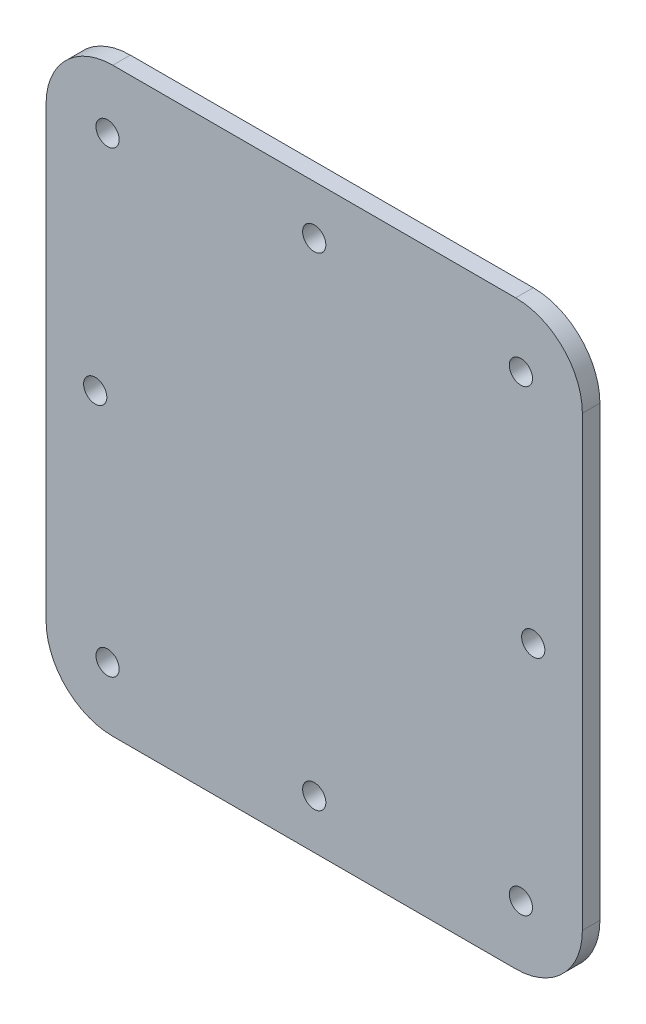
ISO-10303-21;
HEADER;
FILE_DESCRIPTION(('STEP AP214'),'2;1');
FILE_NAME('part.step','',(''),(''),'','','');
FILE_SCHEMA(('AUTOMOTIVE_DESIGN { 1 0 10303 214 1 1 1 1 }'));
ENDSEC;
DATA;
#1=APPLICATION_CONTEXT('core data for automotive mechanical design processes');
#2=APPLICATION_PROTOCOL_DEFINITION('international standard','automotive_design',2000,#1);
#3=PRODUCT_CONTEXT('',#1,'mechanical');
#4=PRODUCT('Part','Part','',(#3));
#5=PRODUCT_RELATED_PRODUCT_CATEGORY('part','',(#4));
#6=PRODUCT_DEFINITION_FORMATION('','',#4);
#7=PRODUCT_DEFINITION_CONTEXT('part definition',#1,'design');
#8=PRODUCT_DEFINITION('design','',#6,#7);
#9=PRODUCT_DEFINITION_SHAPE('','',#8);
#10=(LENGTH_UNIT() NAMED_UNIT(*) SI_UNIT(.MILLI.,.METRE.));
#11=(NAMED_UNIT(*) PLANE_ANGLE_UNIT() SI_UNIT($,.RADIAN.));
#12=(NAMED_UNIT(*) SI_UNIT($,.STERADIAN.) SOLID_ANGLE_UNIT());
#13=UNCERTAINTY_MEASURE_WITH_UNIT(LENGTH_MEASURE(1.E-05),#10,'distance_accuracy_value','');
#14=(GEOMETRIC_REPRESENTATION_CONTEXT(3) GLOBAL_UNCERTAINTY_ASSIGNED_CONTEXT((#13)) GLOBAL_UNIT_ASSIGNED_CONTEXT((#10,
#11,#12)) REPRESENTATION_CONTEXT('',''));
#15=CARTESIAN_POINT('',(0.,0.,0.));
#16=DIRECTION('',(0.,0.,1.));
#17=DIRECTION('',(1.,0.,0.));
#18=AXIS2_PLACEMENT_3D('',#15,#16,#17);
#19=CARTESIAN_POINT('',(88.518997497559,144.39899475097,3.175));
#20=DIRECTION('',(0.,0.,1.));
#21=DIRECTION('',(1.,0.,0.));
#22=AXIS2_PLACEMENT_3D('',#19,#20,#21);
#23=PLANE('',#22);
#24=CARTESIAN_POINT('',(14.6778463120995,62.4298471208155,3.175));
#25=DIRECTION('',(0.,0.,1.));
#26=DIRECTION('',(1.,0.,0.));
#27=AXIS2_PLACEMENT_3D('',#24,#25,#26);
#28=CIRCLE('',#27,2.1);
#29=CARTESIAN_POINT('',(16.7778463120995,62.4298471208155,3.175));
#30=VERTEX_POINT('',#29);
#31=EDGE_CURVE('E253',#30,#30,#28,.T.);
#32=ORIENTED_EDGE('',*,*,#31,.F.);
#33=EDGE_LOOP('',(#32));
#34=FACE_BOUND('',#33,.T.);
#35=CARTESIAN_POINT('',(89.4621511702005,62.4298471208154,3.175));
#36=DIRECTION('',(0.,0.,1.));
#37=DIRECTION('',(1.,0.,0.));
#38=AXIS2_PLACEMENT_3D('',#35,#36,#37);
#39=CIRCLE('',#38,2.1);
#40=CARTESIAN_POINT('',(91.5621511702005,62.4298471208154,3.175));
#41=VERTEX_POINT('',#40);
#42=EDGE_CURVE('E237',#41,#41,#39,.T.);
#43=ORIENTED_EDGE('',*,*,#42,.F.);
#44=EDGE_LOOP('',(#43));
#45=FACE_BOUND('',#44,.T.);
#46=CARTESIAN_POINT('',(89.4621511702005,145.342148423612,3.175));
#47=DIRECTION('',(0.,0.,1.));
#48=DIRECTION('',(1.,0.,0.));
#49=AXIS2_PLACEMENT_3D('',#46,#47,#48);
#50=CIRCLE('',#49,2.1);
#51=CARTESIAN_POINT('',(91.5621511702005,145.342148423612,3.175));
#52=VERTEX_POINT('',#51);
#53=EDGE_CURVE('E221',#52,#52,#50,.T.);
#54=ORIENTED_EDGE('',*,*,#53,.F.);
#55=EDGE_LOOP('',(#54));
#56=FACE_BOUND('',#55,.T.);
#57=CARTESIAN_POINT('',(14.6778463120995,145.342148423611,3.175));
#58=DIRECTION('',(0.,0.,1.));
#59=DIRECTION('',(1.,0.,0.));
#60=AXIS2_PLACEMENT_3D('',#57,#58,#59);
#61=CIRCLE('',#60,2.1);
#62=CARTESIAN_POINT('',(16.7778463120995,145.342148423611,3.175));
#63=VERTEX_POINT('',#62);
#64=EDGE_CURVE('E146',#63,#63,#61,.T.);
#65=ORIENTED_EDGE('',*,*,#64,.F.);
#66=EDGE_LOOP('',(#65));
#67=FACE_BOUND('',#66,.T.);
#68=CARTESIAN_POINT('',(88.518997497559,144.39899475097,3.175));
#69=DIRECTION('',(0.,0.,1.));
#70=DIRECTION('',(1.,0.,0.));
#71=AXIS2_PLACEMENT_3D('',#68,#69,#70);
#72=CIRCLE('',#71,12.065);
#73=CARTESIAN_POINT('',(100.583997497559,144.39899475097,3.175));
#74=VERTEX_POINT('',#73);
#75=CARTESIAN_POINT('',(88.518997497559,156.46399475097,3.175));
#76=VERTEX_POINT('',#75);
#77=EDGE_CURVE('E164',#74,#76,#72,.T.);
#78=ORIENTED_EDGE('',*,*,#77,.T.);
#79=DIRECTION('',(-1.,0.,0.));
#80=VECTOR('',#79,1.);
#81=CARTESIAN_POINT('',(88.518997497559,156.46399475097,3.175));
#82=LINE('',#81,#80);
#83=CARTESIAN_POINT('',(15.620999984741,156.46399475097,3.175));
#84=VERTEX_POINT('',#83);
#85=EDGE_CURVE('E100',#76,#84,#82,.T.);
#86=ORIENTED_EDGE('',*,*,#85,.T.);
#87=CARTESIAN_POINT('',(15.620999984741,144.39899475097,3.175));
#88=DIRECTION('',(0.,0.,1.));
#89=DIRECTION('',(1.,0.,0.));
#90=AXIS2_PLACEMENT_3D('',#87,#88,#89);
#91=CIRCLE('',#90,12.065);
#92=CARTESIAN_POINT('',(3.555999984741,144.39899475097,3.175));
#93=VERTEX_POINT('',#92);
#94=EDGE_CURVE('E185',#84,#93,#91,.T.);
#95=ORIENTED_EDGE('',*,*,#94,.T.);
#96=DIRECTION('',(0.,-1.,0.));
#97=VECTOR('',#96,1.);
#98=CARTESIAN_POINT('',(3.55599998474099,144.39899475097,3.175));
#99=LINE('',#98,#97);
#100=CARTESIAN_POINT('',(3.55599998474099,63.373000793457,3.175));
#101=VERTEX_POINT('',#100);
#102=EDGE_CURVE('E199',#93,#101,#99,.T.);
#103=ORIENTED_EDGE('',*,*,#102,.T.);
#104=CARTESIAN_POINT('',(15.620999984741,63.373000793457,3.175));
#105=DIRECTION('',(0.,0.,1.));
#106=DIRECTION('',(1.,0.,0.));
#107=AXIS2_PLACEMENT_3D('',#104,#105,#106);
#108=CIRCLE('',#107,12.065);
#109=CARTESIAN_POINT('',(15.620999984741,51.308000793457,3.175));
#110=VERTEX_POINT('',#109);
#111=EDGE_CURVE('E119',#101,#110,#108,.T.);
#112=ORIENTED_EDGE('',*,*,#111,.T.);
#113=DIRECTION('',(1.,0.,0.));
#114=VECTOR('',#113,1.);
#115=CARTESIAN_POINT('',(15.620999984741,51.308000793457,3.175));
#116=LINE('',#115,#114);
#117=CARTESIAN_POINT('',(88.518997497559,51.308000793457,3.175));
#118=VERTEX_POINT('',#117);
#119=EDGE_CURVE('E113',#110,#118,#116,.T.);
#120=ORIENTED_EDGE('',*,*,#119,.T.);
#121=CARTESIAN_POINT('',(88.518997497559,63.373000793457,3.175));
#122=DIRECTION('',(0.,0.,1.));
#123=DIRECTION('',(1.,0.,0.));
#124=AXIS2_PLACEMENT_3D('',#121,#122,#123);
#125=CIRCLE('',#124,12.065);
#126=CARTESIAN_POINT('',(100.583997497559,63.373000793457,3.175));
#127=VERTEX_POINT('',#126);
#128=EDGE_CURVE('E117',#118,#127,#125,.T.);
#129=ORIENTED_EDGE('',*,*,#128,.T.);
#130=DIRECTION('',(0.,1.,0.));
#131=VECTOR('',#130,1.);
#132=CARTESIAN_POINT('',(100.583997497559,63.373000793457,3.175));
#133=LINE('',#132,#131);
#134=EDGE_CURVE('E57',#127,#74,#133,.T.);
#135=ORIENTED_EDGE('',*,*,#134,.T.);
#136=EDGE_LOOP('',(#78,#86,#95,#103,#112,#120,#129,#135));
#137=FACE_BOUND('',#136,.T.);
#138=CARTESIAN_POINT('',(52.06999874115,147.57399475097,3.175));
#139=DIRECTION('',(0.,0.,1.));
#140=DIRECTION('',(1.,0.,0.));
#141=AXIS2_PLACEMENT_3D('',#138,#139,#140);
#142=CIRCLE('',#141,2.09999999999999);
#143=CARTESIAN_POINT('',(54.16999874115,147.57399475097,3.175));
#144=VERTEX_POINT('',#143);
#145=EDGE_CURVE('E213',#144,#144,#142,.T.);
#146=ORIENTED_EDGE('',*,*,#145,.F.);
#147=EDGE_LOOP('',(#146));
#148=FACE_BOUND('',#147,.T.);
#149=CARTESIAN_POINT('',(91.693997497559,103.885997772214,3.175));
#150=DIRECTION('',(0.,0.,1.));
#151=DIRECTION('',(1.,0.,0.));
#152=AXIS2_PLACEMENT_3D('',#149,#150,#151);
#153=CIRCLE('',#152,2.1);
#154=CARTESIAN_POINT('',(93.793997497559,103.885997772214,3.175));
#155=VERTEX_POINT('',#154);
#156=EDGE_CURVE('E229',#155,#155,#153,.T.);
#157=ORIENTED_EDGE('',*,*,#156,.F.);
#158=EDGE_LOOP('',(#157));
#159=FACE_BOUND('',#158,.T.);
#160=CARTESIAN_POINT('',(52.06999874115,60.198000793457,3.175));
#161=DIRECTION('',(0.,0.,1.));
#162=DIRECTION('',(1.,0.,0.));
#163=AXIS2_PLACEMENT_3D('',#160,#161,#162);
#164=CIRCLE('',#163,2.1);
#165=CARTESIAN_POINT('',(54.16999874115,60.198000793457,3.175));
#166=VERTEX_POINT('',#165);
#167=EDGE_CURVE('E245',#166,#166,#164,.T.);
#168=ORIENTED_EDGE('',*,*,#167,.F.);
#169=EDGE_LOOP('',(#168));
#170=FACE_BOUND('',#169,.T.);
#171=CARTESIAN_POINT('',(12.445999984741,103.885997772214,3.175));
#172=DIRECTION('',(0.,0.,1.));
#173=DIRECTION('',(1.,0.,0.));
#174=AXIS2_PLACEMENT_3D('',#171,#172,#173);
#175=CIRCLE('',#174,2.1);
#176=CARTESIAN_POINT('',(14.545999984741,103.885997772214,3.175));
#177=VERTEX_POINT('',#176);
#178=EDGE_CURVE('E261',#177,#177,#175,.T.);
#179=ORIENTED_EDGE('',*,*,#178,.F.);
#180=EDGE_LOOP('',(#179));
#181=FACE_BOUND('',#180,.T.);
#182=ADVANCED_FACE('F39',(#34,#45,#56,#67,#137,#148,#159,#170,#181),#23,.T.);
#183=CARTESIAN_POINT('',(88.518997497559,144.39899475097,0.));
#184=DIRECTION('',(0.,0.,1.));
#185=DIRECTION('',(1.,0.,0.));
#186=AXIS2_PLACEMENT_3D('',#183,#184,#185);
#187=PLANE('',#186);
#188=CARTESIAN_POINT('',(88.518997497559,144.39899475097,0.));
#189=DIRECTION('',(0.,0.,1.));
#190=DIRECTION('',(1.,0.,0.));
#191=AXIS2_PLACEMENT_3D('',#188,#189,#190);
#192=CIRCLE('',#191,12.065);
#193=CARTESIAN_POINT('',(100.583997497559,144.39899475097,0.));
#194=VERTEX_POINT('',#193);
#195=CARTESIAN_POINT('',(88.518997497559,156.46399475097,0.));
#196=VERTEX_POINT('',#195);
#197=EDGE_CURVE('E141',#194,#196,#192,.T.);
#198=ORIENTED_EDGE('',*,*,#197,.F.);
#199=DIRECTION('',(0.,1.,0.));
#200=VECTOR('',#199,1.);
#201=CARTESIAN_POINT('',(100.583997497559,63.373000793457,0.));
#202=LINE('',#201,#200);
#203=CARTESIAN_POINT('',(100.583997497559,63.373000793457,0.));
#204=VERTEX_POINT('',#203);
#205=EDGE_CURVE('E92',#204,#194,#202,.T.);
#206=ORIENTED_EDGE('',*,*,#205,.F.);
#207=CARTESIAN_POINT('',(88.518997497559,63.373000793457,0.));
#208=DIRECTION('',(0.,0.,1.));
#209=DIRECTION('',(1.,0.,0.));
#210=AXIS2_PLACEMENT_3D('',#207,#208,#209);
#211=CIRCLE('',#210,12.065);
#212=CARTESIAN_POINT('',(88.518997497559,51.308000793457,0.));
#213=VERTEX_POINT('',#212);
#214=EDGE_CURVE('E86',#213,#204,#211,.T.);
#215=ORIENTED_EDGE('',*,*,#214,.F.);
#216=DIRECTION('',(1.,0.,0.));
#217=VECTOR('',#216,1.);
#218=CARTESIAN_POINT('',(15.620999984741,51.308000793457,0.));
#219=LINE('',#218,#217);
#220=CARTESIAN_POINT('',(15.620999984741,51.308000793457,0.));
#221=VERTEX_POINT('',#220);
#222=EDGE_CURVE('E128',#221,#213,#219,.T.);
#223=ORIENTED_EDGE('',*,*,#222,.F.);
#224=CARTESIAN_POINT('',(15.620999984741,63.373000793457,0.));
#225=DIRECTION('',(0.,0.,1.));
#226=DIRECTION('',(1.,0.,0.));
#227=AXIS2_PLACEMENT_3D('',#224,#225,#226);
#228=CIRCLE('',#227,12.065);
#229=CARTESIAN_POINT('',(3.55599998474099,63.373000793457,0.));
#230=VERTEX_POINT('',#229);
#231=EDGE_CURVE('E155',#230,#221,#228,.T.);
#232=ORIENTED_EDGE('',*,*,#231,.F.);
#233=DIRECTION('',(0.,-1.,0.));
#234=VECTOR('',#233,1.);
#235=CARTESIAN_POINT('',(3.55599998474099,144.39899475097,0.));
#236=LINE('',#235,#234);
#237=CARTESIAN_POINT('',(3.555999984741,144.39899475097,0.));
#238=VERTEX_POINT('',#237);
#239=EDGE_CURVE('E152',#238,#230,#236,.T.);
#240=ORIENTED_EDGE('',*,*,#239,.F.);
#241=CARTESIAN_POINT('',(15.620999984741,144.39899475097,0.));
#242=DIRECTION('',(0.,0.,1.));
#243=DIRECTION('',(1.,0.,0.));
#244=AXIS2_PLACEMENT_3D('',#241,#242,#243);
#245=CIRCLE('',#244,12.065);
#246=CARTESIAN_POINT('',(15.620999984741,156.46399475097,0.));
#247=VERTEX_POINT('',#246);
#248=EDGE_CURVE('E149',#247,#238,#245,.T.);
#249=ORIENTED_EDGE('',*,*,#248,.F.);
#250=DIRECTION('',(-1.,0.,0.));
#251=VECTOR('',#250,1.);
#252=CARTESIAN_POINT('',(88.518997497559,156.46399475097,0.));
#253=LINE('',#252,#251);
#254=EDGE_CURVE('E145',#196,#247,#253,.T.);
#255=ORIENTED_EDGE('',*,*,#254,.F.);
#256=EDGE_LOOP('',(#198,#206,#215,#223,#232,#240,#249,#255));
#257=FACE_BOUND('',#256,.T.);
#258=CARTESIAN_POINT('',(14.6778463120995,145.342148423611,0.));
#259=DIRECTION('',(0.,0.,1.));
#260=DIRECTION('',(1.,0.,0.));
#261=AXIS2_PLACEMENT_3D('',#258,#259,#260);
#262=CIRCLE('',#261,2.1);
#263=CARTESIAN_POINT('',(16.7778463120995,145.342148423611,0.));
#264=VERTEX_POINT('',#263);
#265=EDGE_CURVE('E209',#264,#264,#262,.T.);
#266=ORIENTED_EDGE('',*,*,#265,.T.);
#267=EDGE_LOOP('',(#266));
#268=FACE_BOUND('',#267,.T.);
#269=CARTESIAN_POINT('',(52.06999874115,147.57399475097,0.));
#270=DIRECTION('',(0.,0.,1.));
#271=DIRECTION('',(1.,0.,0.));
#272=AXIS2_PLACEMENT_3D('',#269,#270,#271);
#273=CIRCLE('',#272,2.09999999999999);
#274=CARTESIAN_POINT('',(54.16999874115,147.57399475097,0.));
#275=VERTEX_POINT('',#274);
#276=EDGE_CURVE('E217',#275,#275,#273,.T.);
#277=ORIENTED_EDGE('',*,*,#276,.T.);
#278=EDGE_LOOP('',(#277));
#279=FACE_BOUND('',#278,.T.);
#280=CARTESIAN_POINT('',(89.4621511702005,145.342148423612,0.));
#281=DIRECTION('',(0.,0.,1.));
#282=DIRECTION('',(1.,0.,0.));
#283=AXIS2_PLACEMENT_3D('',#280,#281,#282);
#284=CIRCLE('',#283,2.1);
#285=CARTESIAN_POINT('',(91.5621511702005,145.342148423612,0.));
#286=VERTEX_POINT('',#285);
#287=EDGE_CURVE('E225',#286,#286,#284,.T.);
#288=ORIENTED_EDGE('',*,*,#287,.T.);
#289=EDGE_LOOP('',(#288));
#290=FACE_BOUND('',#289,.T.);
#291=CARTESIAN_POINT('',(91.693997497559,103.885997772214,0.));
#292=DIRECTION('',(0.,0.,1.));
#293=DIRECTION('',(1.,0.,0.));
#294=AXIS2_PLACEMENT_3D('',#291,#292,#293);
#295=CIRCLE('',#294,2.1);
#296=CARTESIAN_POINT('',(93.793997497559,103.885997772214,0.));
#297=VERTEX_POINT('',#296);
#298=EDGE_CURVE('E233',#297,#297,#295,.T.);
#299=ORIENTED_EDGE('',*,*,#298,.T.);
#300=EDGE_LOOP('',(#299));
#301=FACE_BOUND('',#300,.T.);
#302=CARTESIAN_POINT('',(89.4621511702005,62.4298471208154,0.));
#303=DIRECTION('',(0.,0.,1.));
#304=DIRECTION('',(1.,0.,0.));
#305=AXIS2_PLACEMENT_3D('',#302,#303,#304);
#306=CIRCLE('',#305,2.1);
#307=CARTESIAN_POINT('',(91.5621511702005,62.4298471208154,0.));
#308=VERTEX_POINT('',#307);
#309=EDGE_CURVE('E241',#308,#308,#306,.T.);
#310=ORIENTED_EDGE('',*,*,#309,.T.);
#311=EDGE_LOOP('',(#310));
#312=FACE_BOUND('',#311,.T.);
#313=CARTESIAN_POINT('',(52.06999874115,60.198000793457,0.));
#314=DIRECTION('',(0.,0.,1.));
#315=DIRECTION('',(1.,0.,0.));
#316=AXIS2_PLACEMENT_3D('',#313,#314,#315);
#317=CIRCLE('',#316,2.1);
#318=CARTESIAN_POINT('',(54.16999874115,60.198000793457,0.));
#319=VERTEX_POINT('',#318);
#320=EDGE_CURVE('E249',#319,#319,#317,.T.);
#321=ORIENTED_EDGE('',*,*,#320,.T.);
#322=EDGE_LOOP('',(#321));
#323=FACE_BOUND('',#322,.T.);
#324=CARTESIAN_POINT('',(14.6778463120995,62.4298471208155,0.));
#325=DIRECTION('',(0.,0.,1.));
#326=DIRECTION('',(1.,0.,0.));
#327=AXIS2_PLACEMENT_3D('',#324,#325,#326);
#328=CIRCLE('',#327,2.1);
#329=CARTESIAN_POINT('',(16.7778463120995,62.4298471208155,0.));
#330=VERTEX_POINT('',#329);
#331=EDGE_CURVE('E257',#330,#330,#328,.T.);
#332=ORIENTED_EDGE('',*,*,#331,.T.);
#333=EDGE_LOOP('',(#332));
#334=FACE_BOUND('',#333,.T.);
#335=CARTESIAN_POINT('',(12.445999984741,103.885997772214,0.));
#336=DIRECTION('',(0.,0.,1.));
#337=DIRECTION('',(1.,0.,0.));
#338=AXIS2_PLACEMENT_3D('',#335,#336,#337);
#339=CIRCLE('',#338,2.1);
#340=CARTESIAN_POINT('',(14.545999984741,103.885997772214,0.));
#341=VERTEX_POINT('',#340);
#342=EDGE_CURVE('E265',#341,#341,#339,.T.);
#343=ORIENTED_EDGE('',*,*,#342,.T.);
#344=EDGE_LOOP('',(#343));
#345=FACE_BOUND('',#344,.T.);
#346=ADVANCED_FACE('F189',(#257,#268,#279,#290,#301,#312,#323,#334,#345),#187,.F.);
#347=CARTESIAN_POINT('',(88.518997497559,144.39899475097,3.175));
#348=DIRECTION('',(0.,0.,-1.));
#349=DIRECTION('',(-1.,0.,0.));
#350=AXIS2_PLACEMENT_3D('',#347,#348,#349);
#351=CYLINDRICAL_SURFACE('',#350,12.065);
#352=ORIENTED_EDGE('',*,*,#197,.T.);
#353=DIRECTION('',(0.,0.,-1.));
#354=VECTOR('',#353,1.);
#355=CARTESIAN_POINT('',(88.518997497559,156.46399475097,3.175));
#356=LINE('',#355,#354);
#357=EDGE_CURVE('E11',#76,#196,#356,.T.);
#358=ORIENTED_EDGE('',*,*,#357,.F.);
#359=ORIENTED_EDGE('',*,*,#77,.F.);
#360=DIRECTION('',(0.,0.,-1.));
#361=VECTOR('',#360,1.);
#362=CARTESIAN_POINT('',(100.583997497559,144.39899475097,3.175));
#363=LINE('',#362,#361);
#364=EDGE_CURVE('E137',#74,#194,#363,.T.);
#365=ORIENTED_EDGE('',*,*,#364,.T.);
#366=EDGE_LOOP('',(#352,#358,#359,#365));
#367=FACE_BOUND('',#366,.T.);
#368=ADVANCED_FACE('F41',(#367),#351,.T.);
#369=CARTESIAN_POINT('',(88.518997497559,156.46399475097,3.175));
#370=DIRECTION('',(0.,-1.,0.));
#371=DIRECTION('',(1.,0.,0.));
#372=AXIS2_PLACEMENT_3D('',#369,#370,#371);
#373=PLANE('',#372);
#374=ORIENTED_EDGE('',*,*,#254,.T.);
#375=DIRECTION('',(0.,0.,-1.));
#376=VECTOR('',#375,1.);
#377=CARTESIAN_POINT('',(15.620999984741,156.46399475097,3.175));
#378=LINE('',#377,#376);
#379=EDGE_CURVE('E49',#84,#247,#378,.T.);
#380=ORIENTED_EDGE('',*,*,#379,.F.);
#381=ORIENTED_EDGE('',*,*,#85,.F.);
#382=ORIENTED_EDGE('',*,*,#357,.T.);
#383=EDGE_LOOP('',(#374,#380,#381,#382));
#384=FACE_BOUND('',#383,.T.);
#385=ADVANCED_FACE('F301',(#384),#373,.F.);
#386=CARTESIAN_POINT('',(15.620999984741,144.39899475097,3.175));
#387=DIRECTION('',(0.,0.,-1.));
#388=DIRECTION('',(-1.,0.,0.));
#389=AXIS2_PLACEMENT_3D('',#386,#387,#388);
#390=CYLINDRICAL_SURFACE('',#389,12.065);
#391=ORIENTED_EDGE('',*,*,#248,.T.);
#392=DIRECTION('',(0.,0.,-1.));
#393=VECTOR('',#392,1.);
#394=CARTESIAN_POINT('',(3.555999984741,144.39899475097,3.175));
#395=LINE('',#394,#393);
#396=EDGE_CURVE('E175',#93,#238,#395,.T.);
#397=ORIENTED_EDGE('',*,*,#396,.F.);
#398=ORIENTED_EDGE('',*,*,#94,.F.);
#399=ORIENTED_EDGE('',*,*,#379,.T.);
#400=EDGE_LOOP('',(#391,#397,#398,#399));
#401=FACE_BOUND('',#400,.T.);
#402=ADVANCED_FACE('F183',(#401),#390,.T.);
#403=CARTESIAN_POINT('',(3.55599998474099,144.39899475097,3.175));
#404=DIRECTION('',(1.,0.,0.));
#405=DIRECTION('',(0.,0.,-1.));
#406=AXIS2_PLACEMENT_3D('',#403,#404,#405);
#407=PLANE('',#406);
#408=ORIENTED_EDGE('',*,*,#239,.T.);
#409=DIRECTION('',(0.,0.,-1.));
#410=VECTOR('',#409,1.);
#411=CARTESIAN_POINT('',(3.55599998474099,63.373000793457,3.175));
#412=LINE('',#411,#410);
#413=EDGE_CURVE('E171',#101,#230,#412,.T.);
#414=ORIENTED_EDGE('',*,*,#413,.F.);
#415=ORIENTED_EDGE('',*,*,#102,.F.);
#416=ORIENTED_EDGE('',*,*,#396,.T.);
#417=EDGE_LOOP('',(#408,#414,#415,#416));
#418=FACE_BOUND('',#417,.T.);
#419=ADVANCED_FACE('F194',(#418),#407,.F.);
#420=CARTESIAN_POINT('',(15.620999984741,63.373000793457,3.175));
#421=DIRECTION('',(0.,0.,-1.));
#422=DIRECTION('',(-1.,0.,0.));
#423=AXIS2_PLACEMENT_3D('',#420,#421,#422);
#424=CYLINDRICAL_SURFACE('',#423,12.065);
#425=ORIENTED_EDGE('',*,*,#231,.T.);
#426=DIRECTION('',(0.,0.,-1.));
#427=VECTOR('',#426,1.);
#428=CARTESIAN_POINT('',(15.620999984741,51.308000793457,3.175));
#429=LINE('',#428,#427);
#430=EDGE_CURVE('E130',#110,#221,#429,.T.);
#431=ORIENTED_EDGE('',*,*,#430,.F.);
#432=ORIENTED_EDGE('',*,*,#111,.F.);
#433=ORIENTED_EDGE('',*,*,#413,.T.);
#434=EDGE_LOOP('',(#425,#431,#432,#433));
#435=FACE_BOUND('',#434,.T.);
#436=ADVANCED_FACE('F197',(#435),#424,.T.);
#437=CARTESIAN_POINT('',(15.620999984741,51.308000793457,3.175));
#438=DIRECTION('',(0.,1.,0.));
#439=DIRECTION('',(-1.,0.,0.));
#440=AXIS2_PLACEMENT_3D('',#437,#438,#439);
#441=PLANE('',#440);
#442=ORIENTED_EDGE('',*,*,#222,.T.);
#443=DIRECTION('',(0.,0.,-1.));
#444=VECTOR('',#443,1.);
#445=CARTESIAN_POINT('',(88.518997497559,51.308000793457,3.175));
#446=LINE('',#445,#444);
#447=EDGE_CURVE('E125',#118,#213,#446,.T.);
#448=ORIENTED_EDGE('',*,*,#447,.F.);
#449=ORIENTED_EDGE('',*,*,#119,.F.);
#450=ORIENTED_EDGE('',*,*,#430,.T.);
#451=EDGE_LOOP('',(#442,#448,#449,#450));
#452=FACE_BOUND('',#451,.T.);
#453=ADVANCED_FACE('F126',(#452),#441,.F.);
#454=CARTESIAN_POINT('',(88.518997497559,63.373000793457,3.175));
#455=DIRECTION('',(0.,0.,-1.));
#456=DIRECTION('',(-1.,0.,0.));
#457=AXIS2_PLACEMENT_3D('',#454,#455,#456);
#458=CYLINDRICAL_SURFACE('',#457,12.065);
#459=ORIENTED_EDGE('',*,*,#214,.T.);
#460=DIRECTION('',(0.,0.,-1.));
#461=VECTOR('',#460,1.);
#462=CARTESIAN_POINT('',(100.583997497559,63.373000793457,3.175));
#463=LINE('',#462,#461);
#464=EDGE_CURVE('E131',#127,#204,#463,.T.);
#465=ORIENTED_EDGE('',*,*,#464,.F.);
#466=ORIENTED_EDGE('',*,*,#128,.F.);
#467=ORIENTED_EDGE('',*,*,#447,.T.);
#468=EDGE_LOOP('',(#459,#465,#466,#467));
#469=FACE_BOUND('',#468,.T.);
#470=ADVANCED_FACE('F133',(#469),#458,.T.);
#471=CARTESIAN_POINT('',(100.583997497559,63.373000793457,3.175));
#472=DIRECTION('',(-1.,0.,0.));
#473=DIRECTION('',(0.,-1.,0.));
#474=AXIS2_PLACEMENT_3D('',#471,#472,#473);
#475=PLANE('',#474);
#476=ORIENTED_EDGE('',*,*,#205,.T.);
#477=ORIENTED_EDGE('',*,*,#364,.F.);
#478=ORIENTED_EDGE('',*,*,#134,.F.);
#479=ORIENTED_EDGE('',*,*,#464,.T.);
#480=EDGE_LOOP('',(#476,#477,#478,#479));
#481=FACE_BOUND('',#480,.T.);
#482=ADVANCED_FACE('F289',(#481),#475,.F.);
#483=CARTESIAN_POINT('',(14.6778463120995,145.342148423611,3.175));
#484=DIRECTION('',(0.,0.,-1.));
#485=DIRECTION('',(-1.,0.,0.));
#486=AXIS2_PLACEMENT_3D('',#483,#484,#485);
#487=CYLINDRICAL_SURFACE('',#486,2.1);
#488=ORIENTED_EDGE('',*,*,#64,.T.);
#489=EDGE_LOOP('',(#488));
#490=FACE_BOUND('',#489,.T.);
#491=ORIENTED_EDGE('',*,*,#265,.F.);
#492=EDGE_LOOP('',(#491));
#493=FACE_BOUND('',#492,.T.);
#494=ADVANCED_FACE('F286',(#490,#493),#487,.F.);
#495=CARTESIAN_POINT('',(52.06999874115,147.57399475097,3.175));
#496=DIRECTION('',(0.,0.,-1.));
#497=DIRECTION('',(-1.,0.,0.));
#498=AXIS2_PLACEMENT_3D('',#495,#496,#497);
#499=CYLINDRICAL_SURFACE('',#498,2.09999999999999);
#500=ORIENTED_EDGE('',*,*,#145,.T.);
#501=EDGE_LOOP('',(#500));
#502=FACE_BOUND('',#501,.T.);
#503=ORIENTED_EDGE('',*,*,#276,.F.);
#504=EDGE_LOOP('',(#503));
#505=FACE_BOUND('',#504,.T.);
#506=ADVANCED_FACE('F365',(#502,#505),#499,.F.);
#507=CARTESIAN_POINT('',(89.4621511702005,145.342148423612,3.175));
#508=DIRECTION('',(0.,0.,-1.));
#509=DIRECTION('',(-1.,0.,0.));
#510=AXIS2_PLACEMENT_3D('',#507,#508,#509);
#511=CYLINDRICAL_SURFACE('',#510,2.1);
#512=ORIENTED_EDGE('',*,*,#53,.T.);
#513=EDGE_LOOP('',(#512));
#514=FACE_BOUND('',#513,.T.);
#515=ORIENTED_EDGE('',*,*,#287,.F.);
#516=EDGE_LOOP('',(#515));
#517=FACE_BOUND('',#516,.T.);
#518=ADVANCED_FACE('F373',(#514,#517),#511,.F.);
#519=CARTESIAN_POINT('',(91.693997497559,103.885997772214,3.175));
#520=DIRECTION('',(0.,0.,-1.));
#521=DIRECTION('',(-1.,0.,0.));
#522=AXIS2_PLACEMENT_3D('',#519,#520,#521);
#523=CYLINDRICAL_SURFACE('',#522,2.1);
#524=ORIENTED_EDGE('',*,*,#156,.T.);
#525=EDGE_LOOP('',(#524));
#526=FACE_BOUND('',#525,.T.);
#527=ORIENTED_EDGE('',*,*,#298,.F.);
#528=EDGE_LOOP('',(#527));
#529=FACE_BOUND('',#528,.T.);
#530=ADVANCED_FACE('F381',(#526,#529),#523,.F.);
#531=CARTESIAN_POINT('',(89.4621511702005,62.4298471208154,3.175));
#532=DIRECTION('',(0.,0.,-1.));
#533=DIRECTION('',(-1.,0.,0.));
#534=AXIS2_PLACEMENT_3D('',#531,#532,#533);
#535=CYLINDRICAL_SURFACE('',#534,2.1);
#536=ORIENTED_EDGE('',*,*,#42,.T.);
#537=EDGE_LOOP('',(#536));
#538=FACE_BOUND('',#537,.T.);
#539=ORIENTED_EDGE('',*,*,#309,.F.);
#540=EDGE_LOOP('',(#539));
#541=FACE_BOUND('',#540,.T.);
#542=ADVANCED_FACE('F390',(#538,#541),#535,.F.);
#543=CARTESIAN_POINT('',(52.06999874115,60.198000793457,3.175));
#544=DIRECTION('',(0.,0.,-1.));
#545=DIRECTION('',(-1.,0.,0.));
#546=AXIS2_PLACEMENT_3D('',#543,#544,#545);
#547=CYLINDRICAL_SURFACE('',#546,2.1);
#548=ORIENTED_EDGE('',*,*,#167,.T.);
#549=EDGE_LOOP('',(#548));
#550=FACE_BOUND('',#549,.T.);
#551=ORIENTED_EDGE('',*,*,#320,.F.);
#552=EDGE_LOOP('',(#551));
#553=FACE_BOUND('',#552,.T.);
#554=ADVANCED_FACE('F399',(#550,#553),#547,.F.);
#555=CARTESIAN_POINT('',(14.6778463120995,62.4298471208155,3.175));
#556=DIRECTION('',(0.,0.,-1.));
#557=DIRECTION('',(-1.,0.,0.));
#558=AXIS2_PLACEMENT_3D('',#555,#556,#557);
#559=CYLINDRICAL_SURFACE('',#558,2.1);
#560=ORIENTED_EDGE('',*,*,#31,.T.);
#561=EDGE_LOOP('',(#560));
#562=FACE_BOUND('',#561,.T.);
#563=ORIENTED_EDGE('',*,*,#331,.F.);
#564=EDGE_LOOP('',(#563));
#565=FACE_BOUND('',#564,.T.);
#566=ADVANCED_FACE('F408',(#562,#565),#559,.F.);
#567=CARTESIAN_POINT('',(12.445999984741,103.885997772214,3.175));
#568=DIRECTION('',(0.,0.,-1.));
#569=DIRECTION('',(-1.,0.,0.));
#570=AXIS2_PLACEMENT_3D('',#567,#568,#569);
#571=CYLINDRICAL_SURFACE('',#570,2.1);
#572=ORIENTED_EDGE('',*,*,#178,.T.);
#573=EDGE_LOOP('',(#572));
#574=FACE_BOUND('',#573,.T.);
#575=ORIENTED_EDGE('',*,*,#342,.F.);
#576=EDGE_LOOP('',(#575));
#577=FACE_BOUND('',#576,.T.);
#578=ADVANCED_FACE('F273',(#574,#577),#571,.F.);
#579=CLOSED_SHELL('',(#182,#346,#368,#385,#402,#419,#436,#453,#470,#482,#494,#506,#518,#530,
#542,#554,#566,#578));
#580=MANIFOLD_SOLID_BREP('B2',#579);
#581=ADVANCED_BREP_SHAPE_REPRESENTATION('',(#18,#580),#14);
#582=SHAPE_DEFINITION_REPRESENTATION(#9,#581);
ENDSEC;
END-ISO-10303-21;
